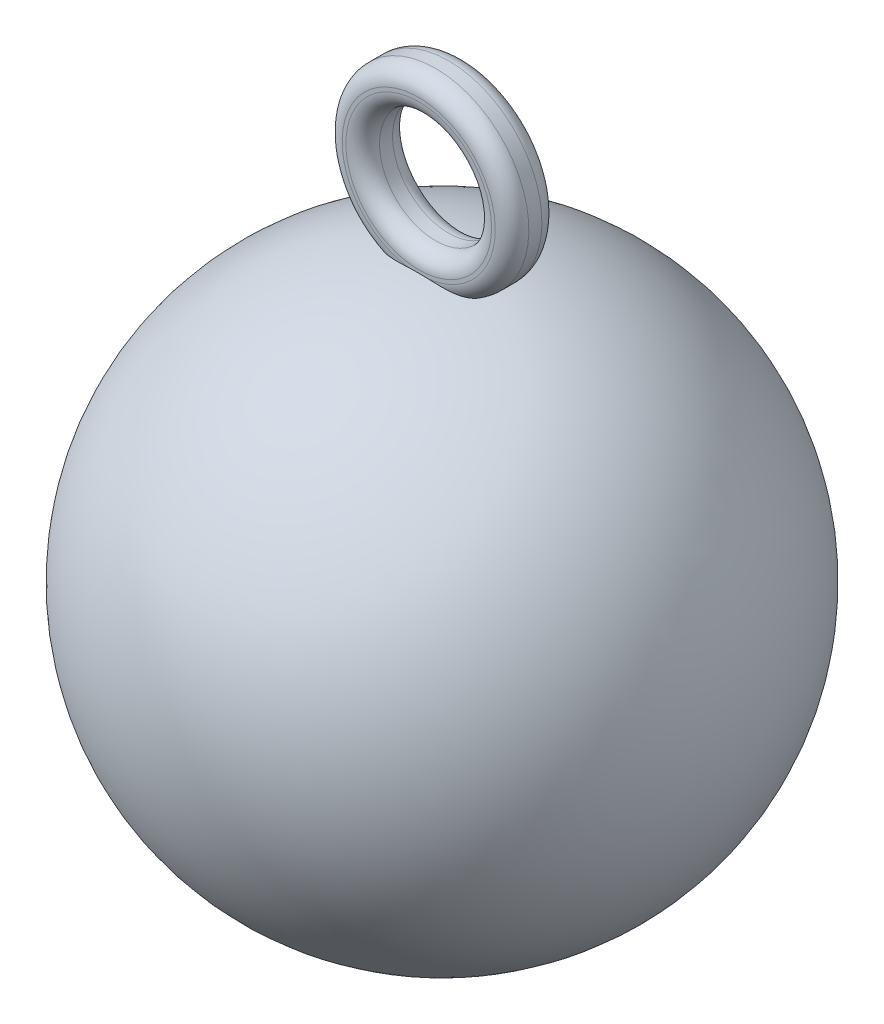
ISO-10303-21;
HEADER;
FILE_DESCRIPTION(('STEP AP214'),'2;1');
FILE_NAME('part.step','',(''),(''),'','','');
FILE_SCHEMA(('AUTOMOTIVE_DESIGN { 1 0 10303 214 1 1 1 1 }'));
ENDSEC;
DATA;
#1=APPLICATION_CONTEXT('core data for automotive mechanical design processes');
#2=APPLICATION_PROTOCOL_DEFINITION('international standard','automotive_design',2000,#1);
#3=PRODUCT_CONTEXT('',#1,'mechanical');
#4=PRODUCT('Part','Part','',(#3));
#5=PRODUCT_RELATED_PRODUCT_CATEGORY('part','',(#4));
#6=PRODUCT_DEFINITION_FORMATION('','',#4);
#7=PRODUCT_DEFINITION_CONTEXT('part definition',#1,'design');
#8=PRODUCT_DEFINITION('design','',#6,#7);
#9=PRODUCT_DEFINITION_SHAPE('','',#8);
#10=(LENGTH_UNIT() NAMED_UNIT(*) SI_UNIT(.MILLI.,.METRE.));
#11=(NAMED_UNIT(*) PLANE_ANGLE_UNIT() SI_UNIT($,.RADIAN.));
#12=(NAMED_UNIT(*) SI_UNIT($,.STERADIAN.) SOLID_ANGLE_UNIT());
#13=UNCERTAINTY_MEASURE_WITH_UNIT(LENGTH_MEASURE(1.E-05),#10,'distance_accuracy_value','');
#14=(GEOMETRIC_REPRESENTATION_CONTEXT(3) GLOBAL_UNCERTAINTY_ASSIGNED_CONTEXT((#13)) GLOBAL_UNIT_ASSIGNED_CONTEXT((#10,
#11,#12)) REPRESENTATION_CONTEXT('',''));
#15=CARTESIAN_POINT('',(0.,0.,0.));
#16=DIRECTION('',(0.,0.,1.));
#17=DIRECTION('',(1.,0.,0.));
#18=AXIS2_PLACEMENT_3D('',#15,#16,#17);
#19=CARTESIAN_POINT('',(0.,19.0043195403949,1.25));
#20=DIRECTION('',(0.,0.,1.));
#21=DIRECTION('',(1.,0.,0.));
#22=AXIS2_PLACEMENT_3D('',#19,#20,#21);
#23=PLANE('',#22);
#24=CARTESIAN_POINT('',(0.,19.0043195403949,1.25));
#25=DIRECTION('',(0.,0.,1.));
#26=DIRECTION('',(1.,0.,0.));
#27=AXIS2_PLACEMENT_3D('',#24,#25,#26);
#28=CIRCLE('',#27,3.9);
#29=CARTESIAN_POINT('',(3.9,19.0043195403949,1.25));
#30=VERTEX_POINT('',#29);
#31=EDGE_CURVE('E92',#30,#30,#28,.F.);
#32=ORIENTED_EDGE('',*,*,#31,.T.);
#33=EDGE_LOOP('',(#32));
#34=FACE_BOUND('',#33,.T.);
#35=CARTESIAN_POINT('',(0.,0.,1.25));
#36=DIRECTION('',(0.,0.,1.));
#37=DIRECTION('',(1.,0.,0.));
#38=AXIS2_PLACEMENT_3D('',#35,#36,#37);
#39=CIRCLE('',#38,14.9478259288767);
#40=CARTESIAN_POINT('',(-0.52823028380367,14.9384896414354,1.25));
#41=VERTEX_POINT('',#40);
#42=CARTESIAN_POINT('',(0.52823028380367,14.9384896414354,1.25));
#43=VERTEX_POINT('',#42);
#44=EDGE_CURVE('E90',#41,#43,#39,.F.);
#45=ORIENTED_EDGE('',*,*,#44,.T.);
#46=CARTESIAN_POINT('',(0.,19.0043195403949,1.25));
#47=DIRECTION('',(0.,0.,1.));
#48=DIRECTION('',(1.,0.,0.));
#49=AXIS2_PLACEMENT_3D('',#46,#47,#48);
#50=CIRCLE('',#49,4.1);
#51=EDGE_CURVE('E81',#43,#41,#50,.T.);
#52=ORIENTED_EDGE('',*,*,#51,.T.);
#53=EDGE_LOOP('',(#45,#52));
#54=FACE_BOUND('',#53,.T.);
#55=ADVANCED_FACE('F33',(#34,#54),#23,.T.);
#56=CARTESIAN_POINT('',(0.,19.0043195403949,-1.25));
#57=DIRECTION('',(0.,0.,1.));
#58=DIRECTION('',(1.,0.,0.));
#59=AXIS2_PLACEMENT_3D('',#56,#57,#58);
#60=PLANE('',#59);
#61=CARTESIAN_POINT('',(0.,19.0043195403949,-1.25));
#62=DIRECTION('',(0.,0.,1.));
#63=DIRECTION('',(1.,0.,0.));
#64=AXIS2_PLACEMENT_3D('',#61,#62,#63);
#65=CIRCLE('',#64,3.9);
#66=CARTESIAN_POINT('',(3.9,19.0043195403949,-1.25));
#67=VERTEX_POINT('',#66);
#68=EDGE_CURVE('E86',#67,#67,#65,.T.);
#69=ORIENTED_EDGE('',*,*,#68,.T.);
#70=EDGE_LOOP('',(#69));
#71=FACE_BOUND('',#70,.T.);
#72=CARTESIAN_POINT('',(0.,0.,-1.25));
#73=DIRECTION('',(0.,0.,1.));
#74=DIRECTION('',(1.,0.,0.));
#75=AXIS2_PLACEMENT_3D('',#72,#73,#74);
#76=CIRCLE('',#75,14.9478259288767);
#77=CARTESIAN_POINT('',(-0.52823028380367,14.9384896414354,-1.25));
#78=VERTEX_POINT('',#77);
#79=CARTESIAN_POINT('',(0.52823028380367,14.9384896414354,-1.25));
#80=VERTEX_POINT('',#79);
#81=EDGE_CURVE('E97',#78,#80,#76,.F.);
#82=ORIENTED_EDGE('',*,*,#81,.F.);
#83=CARTESIAN_POINT('',(0.,19.0043195403949,-1.25));
#84=DIRECTION('',(0.,0.,1.));
#85=DIRECTION('',(1.,0.,0.));
#86=AXIS2_PLACEMENT_3D('',#83,#84,#85);
#87=CIRCLE('',#86,4.1);
#88=EDGE_CURVE('E52',#78,#80,#87,.F.);
#89=ORIENTED_EDGE('',*,*,#88,.T.);
#90=EDGE_LOOP('',(#82,#89));
#91=FACE_BOUND('',#90,.T.);
#92=ADVANCED_FACE('F115',(#71,#91),#60,.F.);
#93=CARTESIAN_POINT('',(0.,19.0043195403949,1.25));
#94=DIRECTION('',(0.,0.,-1.));
#95=DIRECTION('',(-1.,0.,0.));
#96=AXIS2_PLACEMENT_3D('',#93,#94,#95);
#97=CYLINDRICAL_SURFACE('',#96,5.);
#98=CARTESIAN_POINT('',(-2.58269157596996,14.722999157217,1.2502));
#99=CARTESIAN_POINT('',(-2.59401038925156,14.7298306761948,1.14636640959611));
#100=CARTESIAN_POINT('',(-2.60384897524992,14.7358231344624,1.04232485193998));
#101=CARTESIAN_POINT('',(-2.62064016098444,14.7461100603004,0.83392896051955));
#102=CARTESIAN_POINT('',(-2.62759286822536,14.7504045911218,0.729574638552234));
#103=CARTESIAN_POINT('',(-2.6441901970759,14.7606844360198,0.417028579588297));
#104=CARTESIAN_POINT('',(-2.64966406004588,14.764121388315,0.208514289794149));
#105=CARTESIAN_POINT('',(-2.64966406004588,14.764121388315,-0.208514289794149));
#106=CARTESIAN_POINT('',(-2.6441901970759,14.7606844360198,-0.417028579588298));
#107=CARTESIAN_POINT('',(-2.62759286822536,14.7504045911218,-0.729574638552234));
#108=CARTESIAN_POINT('',(-2.62064016098444,14.7461100603004,-0.83392896051955));
#109=CARTESIAN_POINT('',(-2.60384897524992,14.7358231344624,-1.04232485193998));
#110=CARTESIAN_POINT('',(-2.59401038925156,14.7298306761948,-1.14636640959611));
#111=CARTESIAN_POINT('',(-2.58269157596996,14.722999157217,-1.2502));
#112=B_SPLINE_CURVE_WITH_KNOTS('',3,(#98,#99,#100,#101,#102,#103,#104,#105,#106,#107,#108,#109,
#110,#111),.UNSPECIFIED.,.F.,.F.,(4,2,2,2,2,2,4),(0.,0.313985745321993,0.627959792996931,
1.25337428518583,1.87878877737473,2.19276282504967,2.50674857037166),.UNSPECIFIED.);
#113=CARTESIAN_POINT('',(-2.64449944937958,14.7608984368239,0.35));
#114=VERTEX_POINT('',#113);
#115=CARTESIAN_POINT('',(-2.64449944937958,14.7608984368239,-0.35));
#116=VERTEX_POINT('',#115);
#117=EDGE_CURVE('E96',#114,#116,#112,.T.);
#118=ORIENTED_EDGE('',*,*,#117,.F.);
#119=CARTESIAN_POINT('',(0.,19.0043195403949,0.35));
#120=DIRECTION('',(0.,0.,1.));
#121=DIRECTION('',(1.,0.,0.));
#122=AXIS2_PLACEMENT_3D('',#119,#120,#121);
#123=CIRCLE('',#122,5.);
#124=CARTESIAN_POINT('',(2.64449944937958,14.7608984368239,0.35));
#125=VERTEX_POINT('',#124);
#126=EDGE_CURVE('E82',#114,#125,#123,.F.);
#127=ORIENTED_EDGE('',*,*,#126,.T.);
#128=CARTESIAN_POINT('',(2.58269157596996,14.722999157217,-1.2502));
#129=CARTESIAN_POINT('',(2.59401038925156,14.7298306761948,-1.14636640959611));
#130=CARTESIAN_POINT('',(2.60384897524992,14.7358231344624,-1.04232485193998));
#131=CARTESIAN_POINT('',(2.62064016098444,14.7461100603004,-0.833928960519549));
#132=CARTESIAN_POINT('',(2.62759286822536,14.7504045911218,-0.729574638552233));
#133=CARTESIAN_POINT('',(2.6441901970759,14.7606844360198,-0.417028579588297));
#134=CARTESIAN_POINT('',(2.64966406004588,14.764121388315,-0.208514289794148));
#135=CARTESIAN_POINT('',(2.64966406004588,14.764121388315,0.208514289794149));
#136=CARTESIAN_POINT('',(2.6441901970759,14.7606844360198,0.417028579588297));
#137=CARTESIAN_POINT('',(2.62759286822536,14.7504045911218,0.729574638552233));
#138=CARTESIAN_POINT('',(2.62064016098444,14.7461100603004,0.833928960519549));
#139=CARTESIAN_POINT('',(2.60384897524992,14.7358231344624,1.04232485193998));
#140=CARTESIAN_POINT('',(2.59401038925156,14.7298306761948,1.14636640959611));
#141=CARTESIAN_POINT('',(2.58269157596996,14.722999157217,1.2502));
#142=B_SPLINE_CURVE_WITH_KNOTS('',3,(#128,#129,#130,#131,#132,#133,#134,#135,#136,#137,#138,
#139,#140,#141),.UNSPECIFIED.,.F.,.F.,(4,2,2,2,2,2,4),(0.,0.313985745321992,0.62795979299693,
1.25337428518583,1.87878877737472,2.19276282504966,2.50674857037165),.UNSPECIFIED.);
#143=CARTESIAN_POINT('',(2.64449944937958,14.7608984368239,-0.35));
#144=VERTEX_POINT('',#143);
#145=EDGE_CURVE('E100',#144,#125,#142,.T.);
#146=ORIENTED_EDGE('',*,*,#145,.F.);
#147=CARTESIAN_POINT('',(0.,19.0043195403949,-0.35));
#148=DIRECTION('',(0.,0.,1.));
#149=DIRECTION('',(1.,0.,0.));
#150=AXIS2_PLACEMENT_3D('',#147,#148,#149);
#151=CIRCLE('',#150,5.);
#152=EDGE_CURVE('E91',#144,#116,#151,.T.);
#153=ORIENTED_EDGE('',*,*,#152,.T.);
#154=EDGE_LOOP('',(#118,#127,#146,#153));
#155=FACE_BOUND('',#154,.T.);
#156=ADVANCED_FACE('F110',(#155),#97,.T.);
#157=CARTESIAN_POINT('',(0.,19.0043195403949,1.25));
#158=DIRECTION('',(0.,0.,-1.));
#159=DIRECTION('',(-1.,0.,0.));
#160=AXIS2_PLACEMENT_3D('',#157,#158,#159);
#161=CYLINDRICAL_SURFACE('',#160,3.);
#162=CARTESIAN_POINT('',(0.,19.0043195403949,0.35));
#163=DIRECTION('',(0.,0.,1.));
#164=DIRECTION('',(1.,0.,0.));
#165=AXIS2_PLACEMENT_3D('',#162,#163,#164);
#166=CIRCLE('',#165,3.);
#167=CARTESIAN_POINT('',(3.,19.0043195403949,0.35));
#168=VERTEX_POINT('',#167);
#169=EDGE_CURVE('E169',#168,#168,#166,.T.);
#170=ORIENTED_EDGE('',*,*,#169,.T.);
#171=EDGE_LOOP('',(#170));
#172=FACE_BOUND('',#171,.T.);
#173=CARTESIAN_POINT('',(0.,19.0043195403949,-0.35));
#174=DIRECTION('',(0.,0.,1.));
#175=DIRECTION('',(1.,0.,0.));
#176=AXIS2_PLACEMENT_3D('',#173,#174,#175);
#177=CIRCLE('',#176,3.);
#178=CARTESIAN_POINT('',(3.,19.0043195403949,-0.35));
#179=VERTEX_POINT('',#178);
#180=EDGE_CURVE('E171',#179,#179,#177,.F.);
#181=ORIENTED_EDGE('',*,*,#180,.T.);
#182=EDGE_LOOP('',(#181));
#183=FACE_BOUND('',#182,.T.);
#184=ADVANCED_FACE('F114',(#172,#183),#161,.F.);
#185=CARTESIAN_POINT('',(0.,0.,0.));
#186=DIRECTION('',(0.,1.,0.));
#187=DIRECTION('',(1.,0.,0.));
#188=AXIS2_PLACEMENT_3D('',#185,#186,#187);
#189=SPHERICAL_SURFACE('',#188,15.);
#190=ORIENTED_EDGE('',*,*,#44,.F.);
#191=CARTESIAN_POINT('',(-0.528230283803676,14.9384896414354,1.25));
#192=CARTESIAN_POINT('',(-0.569090303062571,14.9370450266086,1.24999741850903));
#193=CARTESIAN_POINT('',(-0.609944472635438,14.9354385719488,1.2499255590429));
#194=CARTESIAN_POINT('',(-0.691641285615335,14.9319122799451,1.24951990058012));
#195=CARTESIAN_POINT('',(-0.732483927773908,14.9299924164248,1.24918607969521));
#196=CARTESIAN_POINT('',(-0.855175409971857,14.9237688848329,1.24760411062086));
#197=CARTESIAN_POINT('',(-0.936996805504273,14.9190081217173,1.24577431045103));
#198=CARTESIAN_POINT('',(-1.10197588882663,14.908281027408,1.23926384419985));
#199=CARTESIAN_POINT('',(-1.18513047532544,14.9022941331874,1.23453136227185));
#200=CARTESIAN_POINT('',(-1.35092744504824,14.8893293684442,1.22058156127711));
#201=CARTESIAN_POINT('',(-1.43357027572084,14.8823525489549,1.21136897400736));
#202=CARTESIAN_POINT('',(-1.60371804572578,14.867084069089,1.18569921534697));
#203=CARTESIAN_POINT('',(-1.69115110217375,14.8587342020997,1.16877369625204));
#204=CARTESIAN_POINT('',(-1.86324821350563,14.8415224609885,1.12491326787516));
#205=CARTESIAN_POINT('',(-1.94792139683329,14.8326626173068,1.09801600820843));
#206=CARTESIAN_POINT('',(-2.08979015164178,14.8173999878292,1.04003123265011));
#207=CARTESIAN_POINT('',(-2.14822898026219,14.8109800645371,1.01203899520286));
#208=CARTESIAN_POINT('',(-2.26037105111175,14.7985472566098,0.947587918724007));
#209=CARTESIAN_POINT('',(-2.31408086673502,14.7925338097586,0.911141096435209));
#210=CARTESIAN_POINT('',(-2.39807648256428,14.7831976004114,0.841598024975397));
#211=CARTESIAN_POINT('',(-2.43042422463709,14.7796226147395,0.811038702525242));
#212=CARTESIAN_POINT('',(-2.49006448202964,14.7731576743602,0.745228658616617));
#213=CARTESIAN_POINT('',(-2.51736262511137,14.7702669560215,0.709983236053675));
#214=CARTESIAN_POINT('',(-2.56081087136904,14.7658873421596,0.641981595643687));
#215=CARTESIAN_POINT('',(-2.57808780432339,14.7642384416589,0.609958706949664));
#216=CARTESIAN_POINT('',(-2.60714175018521,14.761731862072,0.54350222078495));
#217=CARTESIAN_POINT('',(-2.61893063046098,14.7608724717913,0.509074011876719));
#218=CARTESIAN_POINT('',(-2.63253843803609,14.7602305792289,0.453620658012199));
#219=CARTESIAN_POINT('',(-2.6364652710798,14.7601460210537,0.433099854737155));
#220=CARTESIAN_POINT('',(-2.64214180361586,14.7602868118095,0.391735141627788));
#221=CARTESIAN_POINT('',(-2.64388876498833,14.760512549755,0.370890858661162));
#222=CARTESIAN_POINT('',(-2.64449944937958,14.7608984368239,0.35));
#223=B_SPLINE_CURVE_WITH_KNOTS('',3,(#191,#192,#193,#194,#195,#196,#197,#198,#199,#200,#201,
#202,#203,#204,#205,#206,#207,#208,#209,#210,#211,#212,#213,#214,#215,#216,#217,#218,#219,#220,
#221,#222),.UNSPECIFIED.,.F.,.F.,(4,2,2,2,2,2,2,2,2,2,2,2,2,2,2,4),(0.,0.122655714360702,
0.24532167833705,0.491226869092158,0.741654896475344,0.99181899939073,1.25976257623064,
1.52670463230994,1.72152814005652,1.91607641812519,2.04958140647653,2.18293669548347,
2.29177913434745,2.40038510629362,2.46295676381484,2.52560693824908),.UNSPECIFIED.);
#224=EDGE_CURVE('E77',#41,#114,#223,.T.);
#225=ORIENTED_EDGE('',*,*,#224,.T.);
#226=ORIENTED_EDGE('',*,*,#117,.T.);
#227=CARTESIAN_POINT('',(-2.64449944937958,14.7608984368239,-0.35));
#228=CARTESIAN_POINT('',(-2.64394161218288,14.7605478872259,-0.368999373513116));
#229=CARTESIAN_POINT('',(-2.64244740490415,14.7603292413216,-0.387960175328749));
#230=CARTESIAN_POINT('',(-2.63764637638956,14.7601496405859,-0.42563447169989));
#231=CARTESIAN_POINT('',(-2.63434127617825,14.7601884414724,-0.444348183816628));
#232=CARTESIAN_POINT('',(-2.62188091928014,14.7606778820244,-0.49953893052266));
#233=CARTESIAN_POINT('',(-2.61016643472387,14.7614947023467,-0.535460210150466));
#234=CARTESIAN_POINT('',(-2.58085128052732,14.7639803769007,-0.604564535998176));
#235=CARTESIAN_POINT('',(-2.56327132266608,14.7656462438039,-0.637756712093167));
#236=CARTESIAN_POINT('',(-2.52325579626674,14.7696666411824,-0.701099019624262));
#237=CARTESIAN_POINT('',(-2.5008078141024,14.7720229377734,-0.731241079507014));
#238=CARTESIAN_POINT('',(-2.44118784645366,14.7784302870696,-0.800970776622963));
#239=CARTESIAN_POINT('',(-2.40192500265178,14.7827676649934,-0.838740089806318));
#240=CARTESIAN_POINT('',(-2.31803089854243,14.7920971570889,-0.90750934615926));
#241=CARTESIAN_POINT('',(-2.27339397499067,14.7970899624642,-0.938502049535882));
#242=CARTESIAN_POINT('',(-2.15346275319893,14.8104139636523,-1.01076551254712));
#243=CARTESIAN_POINT('',(-2.07546705967548,14.8189944118767,-1.04749399191336));
#244=CARTESIAN_POINT('',(-1.9549572607063,14.8318566215956,-1.09365279758562));
#245=CARTESIAN_POINT('',(-1.91400782674735,14.8361620830223,-1.1075925835665));
#246=CARTESIAN_POINT('',(-1.83129519355508,14.8446958139784,-1.13280465622001));
#247=CARTESIAN_POINT('',(-1.78953237249923,14.8489241176903,-1.14407815196172));
#248=CARTESIAN_POINT('',(-1.64631149650558,14.8630939627653,-1.17856899820698));
#249=CARTESIAN_POINT('',(-1.54350576583585,14.8727069175117,-1.19628480601176));
#250=CARTESIAN_POINT('',(-1.33646606473172,14.8905945531282,-1.22273318628429));
#251=CARTESIAN_POINT('',(-1.23222861069007,14.8988649145459,-1.2314372304803));
#252=CARTESIAN_POINT('',(-1.02774843744153,14.9133752778243,-1.24300376532339));
#253=CARTESIAN_POINT('',(-0.927522225646697,14.9196860810003,-1.24609668796867));
#254=CARTESIAN_POINT('',(-0.777422841512448,14.9277869022912,-1.24871233333164));
#255=CARTESIAN_POINT('',(-0.727594053346824,14.9302536842725,-1.24924845473067));
#256=CARTESIAN_POINT('',(-0.627923367598509,14.9347238391487,-1.2498894078001));
#257=CARTESIAN_POINT('',(-0.578081475148446,14.9367273117066,-1.24999433230733));
#258=CARTESIAN_POINT('',(-0.528230283803679,14.9384896414354,-1.25));
#259=B_SPLINE_CURVE_WITH_KNOTS('',3,(#227,#228,#229,#230,#231,#232,#233,#234,#235,#236,#237,
#238,#239,#240,#241,#242,#243,#244,#245,#246,#247,#248,#249,#250,#251,#252,#253,#254,#255,#256,
#257,#258),.UNSPECIFIED.,.F.,.F.,(4,2,2,2,2,2,2,2,2,2,2,2,2,2,2,4),(0.,0.0569843954296435,
0.113914728103928,0.226610174274985,0.338911816529438,0.451503271731581,0.614537690864085,
0.777745445919186,1.03610526672376,1.16647080969361,1.29677712263041,1.6103518082946,
1.92491616068463,2.22624168065972,2.37591794947143,2.52556199124724),.UNSPECIFIED.);
#260=EDGE_CURVE('E46',#116,#78,#259,.T.);
#261=ORIENTED_EDGE('',*,*,#260,.T.);
#262=ORIENTED_EDGE('',*,*,#81,.T.);
#263=CARTESIAN_POINT('',(0.528230283803676,14.9384896414354,-1.25));
#264=CARTESIAN_POINT('',(0.569090303062571,14.9370450266086,-1.24999741850903));
#265=CARTESIAN_POINT('',(0.609944472635438,14.9354385719488,-1.2499255590429));
#266=CARTESIAN_POINT('',(0.691641285615335,14.9319122799451,-1.24951990058012));
#267=CARTESIAN_POINT('',(0.732483927773908,14.9299924164248,-1.24918607969521));
#268=CARTESIAN_POINT('',(0.855175409971857,14.9237688848329,-1.24760411062086));
#269=CARTESIAN_POINT('',(0.936996805504273,14.9190081217173,-1.24577431045103));
#270=CARTESIAN_POINT('',(1.10197588882663,14.908281027408,-1.23926384419985));
#271=CARTESIAN_POINT('',(1.18513047532544,14.9022941331874,-1.23453136227185));
#272=CARTESIAN_POINT('',(1.35092744504824,14.8893293684442,-1.22058156127711));
#273=CARTESIAN_POINT('',(1.43357027572084,14.8823525489549,-1.21136897400736));
#274=CARTESIAN_POINT('',(1.60371804572578,14.867084069089,-1.18569921534697));
#275=CARTESIAN_POINT('',(1.69115110217375,14.8587342020997,-1.16877369625204));
#276=CARTESIAN_POINT('',(1.86324821350563,14.8415224609885,-1.12491326787516));
#277=CARTESIAN_POINT('',(1.94792139683329,14.8326626173068,-1.09801600820843));
#278=CARTESIAN_POINT('',(2.08979015164178,14.8173999878292,-1.04003123265011));
#279=CARTESIAN_POINT('',(2.14822898026219,14.8109800645371,-1.01203899520286));
#280=CARTESIAN_POINT('',(2.26037105111175,14.7985472566098,-0.947587918724007));
#281=CARTESIAN_POINT('',(2.31408086673502,14.7925338097586,-0.911141096435209));
#282=CARTESIAN_POINT('',(2.39807648256428,14.7831976004114,-0.841598024975397));
#283=CARTESIAN_POINT('',(2.43042422463709,14.7796226147395,-0.811038702525242));
#284=CARTESIAN_POINT('',(2.49006448202964,14.7731576743602,-0.745228658616617));
#285=CARTESIAN_POINT('',(2.51736262511137,14.7702669560215,-0.709983236053675));
#286=CARTESIAN_POINT('',(2.56081087136904,14.7658873421596,-0.641981595643687));
#287=CARTESIAN_POINT('',(2.57808780432339,14.7642384416589,-0.609958706949664));
#288=CARTESIAN_POINT('',(2.60714175018521,14.761731862072,-0.54350222078495));
#289=CARTESIAN_POINT('',(2.61893063046098,14.7608724717913,-0.509074011876719));
#290=CARTESIAN_POINT('',(2.63253843803609,14.7602305792289,-0.453620658012199));
#291=CARTESIAN_POINT('',(2.6364652710798,14.7601460210537,-0.433099854737155));
#292=CARTESIAN_POINT('',(2.64214180361586,14.7602868118095,-0.391735141627788));
#293=CARTESIAN_POINT('',(2.64388876498833,14.760512549755,-0.370890858661162));
#294=CARTESIAN_POINT('',(2.64449944937958,14.7608984368239,-0.35));
#295=B_SPLINE_CURVE_WITH_KNOTS('',3,(#263,#264,#265,#266,#267,#268,#269,#270,#271,#272,#273,
#274,#275,#276,#277,#278,#279,#280,#281,#282,#283,#284,#285,#286,#287,#288,#289,#290,#291,#292,
#293,#294),.UNSPECIFIED.,.F.,.F.,(4,2,2,2,2,2,2,2,2,2,2,2,2,2,2,4),(0.,0.122655714360702,
0.24532167833705,0.491226869092158,0.741654896475344,0.99181899939073,1.25976257623064,
1.52670463230994,1.72152814005652,1.91607641812519,2.04958140647653,2.18293669548347,
2.29177913434745,2.40038510629362,2.46295676381484,2.52560693824908),.UNSPECIFIED.);
#296=EDGE_CURVE('E11',#80,#144,#295,.T.);
#297=ORIENTED_EDGE('',*,*,#296,.T.);
#298=ORIENTED_EDGE('',*,*,#145,.T.);
#299=CARTESIAN_POINT('',(2.64449944937958,14.7608984368239,0.35));
#300=CARTESIAN_POINT('',(2.64394161218288,14.7605478872259,0.368999373513116));
#301=CARTESIAN_POINT('',(2.64244740490415,14.7603292413216,0.387960175328749));
#302=CARTESIAN_POINT('',(2.63764637638956,14.7601496405859,0.42563447169989));
#303=CARTESIAN_POINT('',(2.63434127617825,14.7601884414724,0.444348183816628));
#304=CARTESIAN_POINT('',(2.62188091928014,14.7606778820244,0.49953893052266));
#305=CARTESIAN_POINT('',(2.61016643472387,14.7614947023467,0.535460210150466));
#306=CARTESIAN_POINT('',(2.58085128052732,14.7639803769007,0.604564535998176));
#307=CARTESIAN_POINT('',(2.56327132266608,14.7656462438039,0.637756712093167));
#308=CARTESIAN_POINT('',(2.52325579626674,14.7696666411824,0.701099019624262));
#309=CARTESIAN_POINT('',(2.5008078141024,14.7720229377734,0.731241079507014));
#310=CARTESIAN_POINT('',(2.44118784645366,14.7784302870696,0.800970776622963));
#311=CARTESIAN_POINT('',(2.40192500265178,14.7827676649934,0.838740089806318));
#312=CARTESIAN_POINT('',(2.31803089854243,14.7920971570889,0.90750934615926));
#313=CARTESIAN_POINT('',(2.27339397499067,14.7970899624642,0.938502049535882));
#314=CARTESIAN_POINT('',(2.15346275319893,14.8104139636523,1.01076551254712));
#315=CARTESIAN_POINT('',(2.07546705967548,14.8189944118767,1.04749399191336));
#316=CARTESIAN_POINT('',(1.9549572607063,14.8318566215956,1.09365279758562));
#317=CARTESIAN_POINT('',(1.91400782674735,14.8361620830223,1.1075925835665));
#318=CARTESIAN_POINT('',(1.83129519355508,14.8446958139784,1.13280465622001));
#319=CARTESIAN_POINT('',(1.78953237249923,14.8489241176903,1.14407815196172));
#320=CARTESIAN_POINT('',(1.64631149650558,14.8630939627653,1.17856899820698));
#321=CARTESIAN_POINT('',(1.54350576583585,14.8727069175117,1.19628480601176));
#322=CARTESIAN_POINT('',(1.33646606473172,14.8905945531282,1.22273318628429));
#323=CARTESIAN_POINT('',(1.23222861069007,14.8988649145459,1.2314372304803));
#324=CARTESIAN_POINT('',(1.02774843744153,14.9133752778243,1.24300376532339));
#325=CARTESIAN_POINT('',(0.927522225646697,14.9196860810003,1.24609668796867));
#326=CARTESIAN_POINT('',(0.777422841512448,14.9277869022912,1.24871233333164));
#327=CARTESIAN_POINT('',(0.727594053346824,14.9302536842725,1.24924845473067));
#328=CARTESIAN_POINT('',(0.627923367598509,14.9347238391487,1.2498894078001));
#329=CARTESIAN_POINT('',(0.578081475148446,14.9367273117066,1.24999433230733));
#330=CARTESIAN_POINT('',(0.528230283803679,14.9384896414354,1.25));
#331=B_SPLINE_CURVE_WITH_KNOTS('',3,(#299,#300,#301,#302,#303,#304,#305,#306,#307,#308,#309,
#310,#311,#312,#313,#314,#315,#316,#317,#318,#319,#320,#321,#322,#323,#324,#325,#326,#327,#328,
#329,#330),.UNSPECIFIED.,.F.,.F.,(4,2,2,2,2,2,2,2,2,2,2,2,2,2,2,4),(0.,0.0569843954296435,
0.113914728103928,0.226610174274985,0.338911816529438,0.451503271731581,0.614537690864085,
0.777745445919186,1.03610526672376,1.16647080969361,1.29677712263041,1.6103518082946,
1.92491616068463,2.22624168065972,2.37591794947143,2.52556199124724),.UNSPECIFIED.);
#332=EDGE_CURVE('E85',#125,#43,#331,.T.);
#333=ORIENTED_EDGE('',*,*,#332,.T.);
#334=EDGE_LOOP('',(#190,#225,#226,#261,#262,#297,#298,#333));
#335=FACE_BOUND('',#334,.T.);
#336=ADVANCED_FACE('F94',(#335),#189,.T.);
#337=CARTESIAN_POINT('',(0.,19.0043195403949,0.35));
#338=DIRECTION('',(0.,0.,1.));
#339=DIRECTION('',(1.,0.,0.));
#340=AXIS2_PLACEMENT_3D('',#337,#338,#339);
#341=TOROIDAL_SURFACE('',#340,4.1,0.9);
#342=ORIENTED_EDGE('',*,*,#332,.F.);
#343=ORIENTED_EDGE('',*,*,#126,.F.);
#344=ORIENTED_EDGE('',*,*,#224,.F.);
#345=ORIENTED_EDGE('',*,*,#51,.F.);
#346=EDGE_LOOP('',(#342,#343,#344,#345));
#347=FACE_BOUND('',#346,.T.);
#348=ADVANCED_FACE('F80',(#347),#341,.T.);
#349=CARTESIAN_POINT('',(0.,19.0043195403949,0.35));
#350=DIRECTION('',(0.,0.,1.));
#351=DIRECTION('',(1.,0.,0.));
#352=AXIS2_PLACEMENT_3D('',#349,#350,#351);
#353=TOROIDAL_SURFACE('',#352,3.9,0.9);
#354=ORIENTED_EDGE('',*,*,#31,.F.);
#355=EDGE_LOOP('',(#354));
#356=FACE_BOUND('',#355,.T.);
#357=ORIENTED_EDGE('',*,*,#169,.F.);
#358=EDGE_LOOP('',(#357));
#359=FACE_BOUND('',#358,.T.);
#360=ADVANCED_FACE('F140',(#356,#359),#353,.T.);
#361=CARTESIAN_POINT('',(0.,19.0043195403949,-0.35));
#362=DIRECTION('',(0.,0.,1.));
#363=DIRECTION('',(1.,0.,0.));
#364=AXIS2_PLACEMENT_3D('',#361,#362,#363);
#365=TOROIDAL_SURFACE('',#364,3.9,0.9);
#366=ORIENTED_EDGE('',*,*,#180,.F.);
#367=EDGE_LOOP('',(#366));
#368=FACE_BOUND('',#367,.T.);
#369=ORIENTED_EDGE('',*,*,#68,.F.);
#370=EDGE_LOOP('',(#369));
#371=FACE_BOUND('',#370,.T.);
#372=ADVANCED_FACE('F143',(#368,#371),#365,.T.);
#373=CARTESIAN_POINT('',(0.,19.0043195403949,-0.35));
#374=DIRECTION('',(0.,0.,1.));
#375=DIRECTION('',(1.,0.,0.));
#376=AXIS2_PLACEMENT_3D('',#373,#374,#375);
#377=TOROIDAL_SURFACE('',#376,4.1,0.9);
#378=ORIENTED_EDGE('',*,*,#296,.F.);
#379=ORIENTED_EDGE('',*,*,#88,.F.);
#380=ORIENTED_EDGE('',*,*,#260,.F.);
#381=ORIENTED_EDGE('',*,*,#152,.F.);
#382=EDGE_LOOP('',(#378,#379,#380,#381));
#383=FACE_BOUND('',#382,.T.);
#384=ADVANCED_FACE('F35',(#383),#377,.T.);
#385=CLOSED_SHELL('',(#55,#92,#156,#184,#336,#348,#360,#372,#384));
#386=MANIFOLD_SOLID_BREP('B2',#385);
#387=ADVANCED_BREP_SHAPE_REPRESENTATION('',(#18,#386),#14);
#388=SHAPE_DEFINITION_REPRESENTATION(#9,#387);
ENDSEC;
END-ISO-10303-21;
